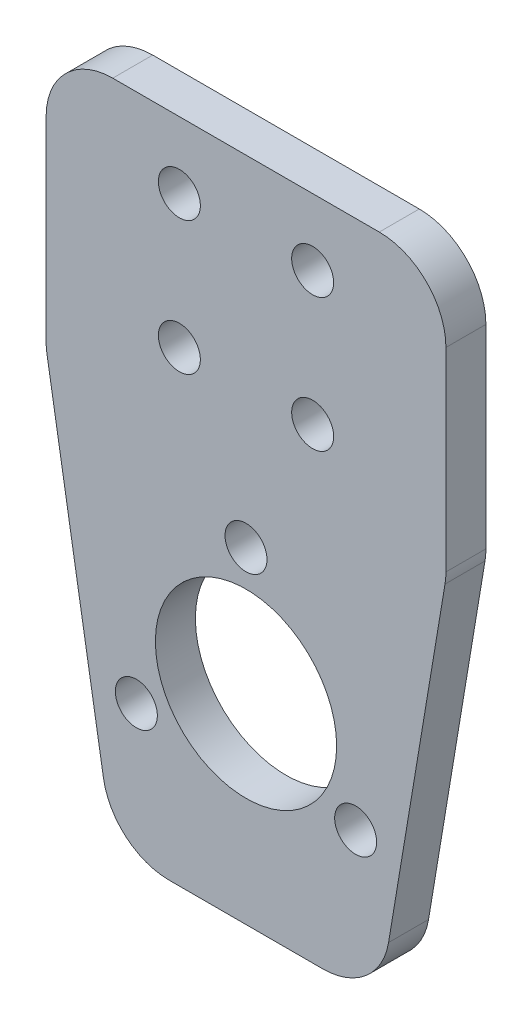
ISO-10303-21;
HEADER;
FILE_DESCRIPTION(('STEP AP214'),'2;1');
FILE_NAME('part.step','',(''),(''),'','','');
FILE_SCHEMA(('AUTOMOTIVE_DESIGN { 1 0 10303 214 1 1 1 1 }'));
ENDSEC;
DATA;
#1=APPLICATION_CONTEXT('core data for automotive mechanical design processes');
#2=APPLICATION_PROTOCOL_DEFINITION('international standard','automotive_design',2000,#1);
#3=PRODUCT_CONTEXT('',#1,'mechanical');
#4=PRODUCT('Part','Part','',(#3));
#5=PRODUCT_RELATED_PRODUCT_CATEGORY('part','',(#4));
#6=PRODUCT_DEFINITION_FORMATION('','',#4);
#7=PRODUCT_DEFINITION_CONTEXT('part definition',#1,'design');
#8=PRODUCT_DEFINITION('design','',#6,#7);
#9=PRODUCT_DEFINITION_SHAPE('','',#8);
#10=(LENGTH_UNIT() NAMED_UNIT(*) SI_UNIT(.MILLI.,.METRE.));
#11=(NAMED_UNIT(*) PLANE_ANGLE_UNIT() SI_UNIT($,.RADIAN.));
#12=(NAMED_UNIT(*) SI_UNIT($,.STERADIAN.) SOLID_ANGLE_UNIT());
#13=UNCERTAINTY_MEASURE_WITH_UNIT(LENGTH_MEASURE(1.E-05),#10,'distance_accuracy_value','');
#14=(GEOMETRIC_REPRESENTATION_CONTEXT(3) GLOBAL_UNCERTAINTY_ASSIGNED_CONTEXT((#13)) GLOBAL_UNIT_ASSIGNED_CONTEXT((#10,
#11,#12)) REPRESENTATION_CONTEXT('',''));
#15=CARTESIAN_POINT('',(0.,0.,0.));
#16=DIRECTION('',(0.,0.,1.));
#17=DIRECTION('',(1.,0.,0.));
#18=AXIS2_PLACEMENT_3D('',#15,#16,#17);
#19=CARTESIAN_POINT('',(30.,0.,3.));
#20=DIRECTION('',(0.,-1.,0.));
#21=DIRECTION('',(1.,0.,0.));
#22=AXIS2_PLACEMENT_3D('',#19,#20,#21);
#23=PLANE('',#22);
#24=DIRECTION('',(-1.,0.,0.));
#25=VECTOR('',#24,1.);
#26=CARTESIAN_POINT('',(30.,0.,3.));
#27=LINE('',#26,#25);
#28=CARTESIAN_POINT('',(25.,0.,3.));
#29=VERTEX_POINT('',#28);
#30=CARTESIAN_POINT('',(5.,0.,3.));
#31=VERTEX_POINT('',#30);
#32=EDGE_CURVE('E169',#29,#31,#27,.T.);
#33=ORIENTED_EDGE('',*,*,#32,.F.);
#34=DIRECTION('',(0.,0.,-1.));
#35=VECTOR('',#34,1.);
#36=CARTESIAN_POINT('',(25.,0.,3.));
#37=LINE('',#36,#35);
#38=CARTESIAN_POINT('',(25.,0.,0.));
#39=VERTEX_POINT('',#38);
#40=EDGE_CURVE('E11',#29,#39,#37,.T.);
#41=ORIENTED_EDGE('',*,*,#40,.T.);
#42=DIRECTION('',(-1.,0.,0.));
#43=VECTOR('',#42,1.);
#44=CARTESIAN_POINT('',(30.,0.,0.));
#45=LINE('',#44,#43);
#46=CARTESIAN_POINT('',(5.,0.,0.));
#47=VERTEX_POINT('',#46);
#48=EDGE_CURVE('E239',#39,#47,#45,.T.);
#49=ORIENTED_EDGE('',*,*,#48,.T.);
#50=DIRECTION('',(0.,0.,-1.));
#51=VECTOR('',#50,1.);
#52=CARTESIAN_POINT('',(5.,0.,3.));
#53=LINE('',#52,#51);
#54=EDGE_CURVE('E52',#47,#31,#53,.F.);
#55=ORIENTED_EDGE('',*,*,#54,.T.);
#56=EDGE_LOOP('',(#33,#41,#49,#55));
#57=FACE_BOUND('',#56,.T.);
#58=ADVANCED_FACE('F43',(#57),#23,.F.);
#59=CARTESIAN_POINT('',(0.,0.,3.));
#60=DIRECTION('',(1.,0.,0.));
#61=DIRECTION('',(0.,1.,0.));
#62=AXIS2_PLACEMENT_3D('',#59,#60,#61);
#63=PLANE('',#62);
#64=DIRECTION('',(0.,-1.,0.));
#65=VECTOR('',#64,1.);
#66=CARTESIAN_POINT('',(0.,0.,0.));
#67=LINE('',#66,#65);
#68=CARTESIAN_POINT('',(0.,-5.,0.));
#69=VERTEX_POINT('',#68);
#70=CARTESIAN_POINT('',(0.,-19.5861873485089,0.));
#71=VERTEX_POINT('',#70);
#72=EDGE_CURVE('E255',#69,#71,#67,.T.);
#73=ORIENTED_EDGE('',*,*,#72,.T.);
#74=DIRECTION('',(0.,0.,-1.));
#75=VECTOR('',#74,1.);
#76=CARTESIAN_POINT('',(0.,-19.5861873485089,3.));
#77=LINE('',#76,#75);
#78=CARTESIAN_POINT('',(0.,-19.5861873485089,3.));
#79=VERTEX_POINT('',#78);
#80=EDGE_CURVE('E223',#71,#79,#77,.F.);
#81=ORIENTED_EDGE('',*,*,#80,.T.);
#82=DIRECTION('',(0.,-1.,0.));
#83=VECTOR('',#82,1.);
#84=CARTESIAN_POINT('',(0.,0.,3.));
#85=LINE('',#84,#83);
#86=CARTESIAN_POINT('',(0.,-5.,3.));
#87=VERTEX_POINT('',#86);
#88=EDGE_CURVE('E248',#87,#79,#85,.T.);
#89=ORIENTED_EDGE('',*,*,#88,.F.);
#90=DIRECTION('',(0.,0.,-1.));
#91=VECTOR('',#90,1.);
#92=CARTESIAN_POINT('',(0.,-5.,3.));
#93=LINE('',#92,#91);
#94=EDGE_CURVE('E219',#87,#69,#93,.T.);
#95=ORIENTED_EDGE('',*,*,#94,.T.);
#96=EDGE_LOOP('',(#73,#81,#89,#95));
#97=FACE_BOUND('',#96,.T.);
#98=ADVANCED_FACE('F254',(#97),#63,.F.);
#99=CARTESIAN_POINT('',(0.,-20.,3.));
#100=DIRECTION('',(0.986393923832144,0.164398987305357,0.));
#101=DIRECTION('',(-0.164398987305357,0.986393923832144,0.));
#102=AXIS2_PLACEMENT_3D('',#99,#100,#101);
#103=PLANE('',#102);
#104=DIRECTION('',(0.164398987305357,-0.986393923832144,0.));
#105=VECTOR('',#104,1.);
#106=CARTESIAN_POINT('',(0.,-20.,0.));
#107=LINE('',#106,#105);
#108=CARTESIAN_POINT('',(0.0680303808392843,-20.4081822850357,0.));
#109=VERTEX_POINT('',#108);
#110=CARTESIAN_POINT('',(4.30366582275447,-45.8219949365268,0.));
#111=VERTEX_POINT('',#110);
#112=EDGE_CURVE('E171',#109,#111,#107,.T.);
#113=ORIENTED_EDGE('',*,*,#112,.T.);
#114=DIRECTION('',(0.,0.,-1.));
#115=VECTOR('',#114,1.);
#116=CARTESIAN_POINT('',(4.30366582275447,-45.8219949365268,3.));
#117=LINE('',#116,#115);
#118=CARTESIAN_POINT('',(4.30366582275447,-45.8219949365268,3.));
#119=VERTEX_POINT('',#118);
#120=EDGE_CURVE('E216',#111,#119,#117,.F.);
#121=ORIENTED_EDGE('',*,*,#120,.T.);
#122=DIRECTION('',(0.164398987305357,-0.986393923832144,0.));
#123=VECTOR('',#122,1.);
#124=CARTESIAN_POINT('',(0.,-20.,3.));
#125=LINE('',#124,#123);
#126=CARTESIAN_POINT('',(0.0680303808392843,-20.4081822850357,3.));
#127=VERTEX_POINT('',#126);
#128=EDGE_CURVE('E273',#127,#119,#125,.T.);
#129=ORIENTED_EDGE('',*,*,#128,.F.);
#130=DIRECTION('',(0.,0.,-1.));
#131=VECTOR('',#130,1.);
#132=CARTESIAN_POINT('',(0.0680303808392844,-20.4081822850357,3.));
#133=LINE('',#132,#131);
#134=EDGE_CURVE('E212',#127,#109,#133,.T.);
#135=ORIENTED_EDGE('',*,*,#134,.T.);
#136=EDGE_LOOP('',(#113,#121,#129,#135));
#137=FACE_BOUND('',#136,.T.);
#138=ADVANCED_FACE('F374',(#137),#103,.F.);
#139=CARTESIAN_POINT('',(25.,-50.,3.));
#140=DIRECTION('',(0.,1.,0.));
#141=DIRECTION('',(0.,0.,1.));
#142=AXIS2_PLACEMENT_3D('',#139,#140,#141);
#143=PLANE('',#142);
#144=DIRECTION('',(1.,0.,0.));
#145=VECTOR('',#144,1.);
#146=CARTESIAN_POINT('',(25.,-50.,0.));
#147=LINE('',#146,#145);
#148=CARTESIAN_POINT('',(9.23563544191519,-50.,0.));
#149=VERTEX_POINT('',#148);
#150=CARTESIAN_POINT('',(20.7643645580848,-50.,0.));
#151=VERTEX_POINT('',#150);
#152=EDGE_CURVE('E165',#149,#151,#147,.T.);
#153=ORIENTED_EDGE('',*,*,#152,.T.);
#154=DIRECTION('',(0.,0.,-1.));
#155=VECTOR('',#154,1.);
#156=CARTESIAN_POINT('',(20.7643645580848,-50.,3.));
#157=LINE('',#156,#155);
#158=CARTESIAN_POINT('',(20.7643645580848,-50.,3.));
#159=VERTEX_POINT('',#158);
#160=EDGE_CURVE('E140',#151,#159,#157,.F.);
#161=ORIENTED_EDGE('',*,*,#160,.T.);
#162=DIRECTION('',(1.,0.,0.));
#163=VECTOR('',#162,1.);
#164=CARTESIAN_POINT('',(25.,-50.,3.));
#165=LINE('',#164,#163);
#166=CARTESIAN_POINT('',(9.23563544191519,-50.,3.));
#167=VERTEX_POINT('',#166);
#168=EDGE_CURVE('E270',#167,#159,#165,.T.);
#169=ORIENTED_EDGE('',*,*,#168,.F.);
#170=DIRECTION('',(0.,0.,-1.));
#171=VECTOR('',#170,1.);
#172=CARTESIAN_POINT('',(9.23563544191519,-50.,3.));
#173=LINE('',#172,#171);
#174=EDGE_CURVE('E146',#167,#149,#173,.T.);
#175=ORIENTED_EDGE('',*,*,#174,.T.);
#176=EDGE_LOOP('',(#153,#161,#169,#175));
#177=FACE_BOUND('',#176,.T.);
#178=ADVANCED_FACE('F403',(#177),#143,.F.);
#179=CARTESIAN_POINT('',(30.,-20.,3.));
#180=DIRECTION('',(-0.986393923832144,0.164398987305357,0.));
#181=DIRECTION('',(-0.164398987305357,-0.986393923832144,0.));
#182=AXIS2_PLACEMENT_3D('',#179,#180,#181);
#183=PLANE('',#182);
#184=DIRECTION('',(0.164398987305357,0.986393923832144,0.));
#185=VECTOR('',#184,1.);
#186=CARTESIAN_POINT('',(30.,-20.,3.));
#187=LINE('',#186,#185);
#188=CARTESIAN_POINT('',(25.6963341772455,-45.8219949365268,3.));
#189=VERTEX_POINT('',#188);
#190=CARTESIAN_POINT('',(29.9319696191607,-20.4081822850357,3.));
#191=VERTEX_POINT('',#190);
#192=EDGE_CURVE('E155',#189,#191,#187,.T.);
#193=ORIENTED_EDGE('',*,*,#192,.F.);
#194=DIRECTION('',(0.,0.,-1.));
#195=VECTOR('',#194,1.);
#196=CARTESIAN_POINT('',(25.6963341772455,-45.8219949365268,3.));
#197=LINE('',#196,#195);
#198=CARTESIAN_POINT('',(25.6963341772455,-45.8219949365268,0.));
#199=VERTEX_POINT('',#198);
#200=EDGE_CURVE('E139',#189,#199,#197,.T.);
#201=ORIENTED_EDGE('',*,*,#200,.T.);
#202=DIRECTION('',(0.164398987305357,0.986393923832144,0.));
#203=VECTOR('',#202,1.);
#204=CARTESIAN_POINT('',(30.,-20.,0.));
#205=LINE('',#204,#203);
#206=CARTESIAN_POINT('',(29.9319696191607,-20.4081822850357,0.));
#207=VERTEX_POINT('',#206);
#208=EDGE_CURVE('E153',#199,#207,#205,.T.);
#209=ORIENTED_EDGE('',*,*,#208,.T.);
#210=DIRECTION('',(0.,0.,-1.));
#211=VECTOR('',#210,1.);
#212=CARTESIAN_POINT('',(29.9319696191607,-20.4081822850357,3.));
#213=LINE('',#212,#211);
#214=EDGE_CURVE('E158',#207,#191,#213,.F.);
#215=ORIENTED_EDGE('',*,*,#214,.T.);
#216=EDGE_LOOP('',(#193,#201,#209,#215));
#217=FACE_BOUND('',#216,.T.);
#218=ADVANCED_FACE('F152',(#217),#183,.F.);
#219=CARTESIAN_POINT('',(30.,-20.,3.));
#220=DIRECTION('',(-1.,0.,0.));
#221=DIRECTION('',(0.,-1.,0.));
#222=AXIS2_PLACEMENT_3D('',#219,#220,#221);
#223=PLANE('',#222);
#224=DIRECTION('',(0.,1.,0.));
#225=VECTOR('',#224,1.);
#226=CARTESIAN_POINT('',(30.,-20.,3.));
#227=LINE('',#226,#225);
#228=CARTESIAN_POINT('',(30.,-19.5861873485089,3.));
#229=VERTEX_POINT('',#228);
#230=CARTESIAN_POINT('',(30.,-5.,3.));
#231=VERTEX_POINT('',#230);
#232=EDGE_CURVE('E176',#229,#231,#227,.T.);
#233=ORIENTED_EDGE('',*,*,#232,.F.);
#234=DIRECTION('',(0.,0.,-1.));
#235=VECTOR('',#234,1.);
#236=CARTESIAN_POINT('',(30.,-19.5861873485089,3.));
#237=LINE('',#236,#235);
#238=CARTESIAN_POINT('',(30.,-19.5861873485089,0.));
#239=VERTEX_POINT('',#238);
#240=EDGE_CURVE('E228',#229,#239,#237,.T.);
#241=ORIENTED_EDGE('',*,*,#240,.T.);
#242=DIRECTION('',(0.,1.,0.));
#243=VECTOR('',#242,1.);
#244=CARTESIAN_POINT('',(30.,-20.,0.));
#245=LINE('',#244,#243);
#246=CARTESIAN_POINT('',(30.,-5.,0.));
#247=VERTEX_POINT('',#246);
#248=EDGE_CURVE('E164',#239,#247,#245,.T.);
#249=ORIENTED_EDGE('',*,*,#248,.T.);
#250=DIRECTION('',(0.,0.,-1.));
#251=VECTOR('',#250,1.);
#252=CARTESIAN_POINT('',(30.,-5.,3.));
#253=LINE('',#252,#251);
#254=EDGE_CURVE('E59',#247,#231,#253,.F.);
#255=ORIENTED_EDGE('',*,*,#254,.T.);
#256=EDGE_LOOP('',(#233,#241,#249,#255));
#257=FACE_BOUND('',#256,.T.);
#258=ADVANCED_FACE('F347',(#257),#223,.F.);
#259=CARTESIAN_POINT('',(0.,0.,3.));
#260=DIRECTION('',(0.,0.,1.));
#261=DIRECTION('',(1.,0.,0.));
#262=AXIS2_PLACEMENT_3D('',#259,#260,#261);
#263=PLANE('',#262);
#264=CARTESIAN_POINT('',(23.2272413359522,-39.75,3.));
#265=DIRECTION('',(0.,0.,1.));
#266=DIRECTION('',(1.,0.,0.));
#267=AXIS2_PLACEMENT_3D('',#264,#265,#266);
#268=CIRCLE('',#267,1.575);
#269=CARTESIAN_POINT('',(24.8022413359522,-39.75,3.));
#270=VERTEX_POINT('',#269);
#271=EDGE_CURVE('E292',#270,#270,#268,.T.);
#272=ORIENTED_EDGE('',*,*,#271,.F.);
#273=EDGE_LOOP('',(#272));
#274=FACE_BOUND('',#273,.T.);
#275=CARTESIAN_POINT('',(15.,-35.,3.));
#276=DIRECTION('',(0.,0.,1.));
#277=DIRECTION('',(1.,0.,0.));
#278=AXIS2_PLACEMENT_3D('',#275,#276,#277);
#279=CIRCLE('',#278,6.8);
#280=CARTESIAN_POINT('',(21.8,-35.,3.));
#281=VERTEX_POINT('',#280);
#282=EDGE_CURVE('E291',#281,#281,#279,.T.);
#283=ORIENTED_EDGE('',*,*,#282,.F.);
#284=EDGE_LOOP('',(#283));
#285=FACE_BOUND('',#284,.T.);
#286=CARTESIAN_POINT('',(6.77275866404783,-39.75,3.));
#287=DIRECTION('',(0.,0.,1.));
#288=DIRECTION('',(1.,0.,0.));
#289=AXIS2_PLACEMENT_3D('',#286,#287,#288);
#290=CIRCLE('',#289,1.575);
#291=CARTESIAN_POINT('',(8.34775866404784,-39.75,3.));
#292=VERTEX_POINT('',#291);
#293=EDGE_CURVE('E301',#292,#292,#290,.T.);
#294=ORIENTED_EDGE('',*,*,#293,.F.);
#295=EDGE_LOOP('',(#294));
#296=FACE_BOUND('',#295,.T.);
#297=CARTESIAN_POINT('',(10.,-15.,3.));
#298=DIRECTION('',(0.,0.,1.));
#299=DIRECTION('',(1.,0.,0.));
#300=AXIS2_PLACEMENT_3D('',#297,#298,#299);
#301=CIRCLE('',#300,1.575);
#302=CARTESIAN_POINT('',(11.575,-15.,3.));
#303=VERTEX_POINT('',#302);
#304=EDGE_CURVE('E283',#303,#303,#301,.T.);
#305=ORIENTED_EDGE('',*,*,#304,.F.);
#306=EDGE_LOOP('',(#305));
#307=FACE_BOUND('',#306,.T.);
#308=CARTESIAN_POINT('',(20.,-15.,3.));
#309=DIRECTION('',(0.,0.,1.));
#310=DIRECTION('',(-1.,0.,0.));
#311=AXIS2_PLACEMENT_3D('',#308,#309,#310);
#312=CIRCLE('',#311,1.575);
#313=CARTESIAN_POINT('',(18.425,-15.,3.));
#314=VERTEX_POINT('',#313);
#315=EDGE_CURVE('E316',#314,#314,#312,.T.);
#316=ORIENTED_EDGE('',*,*,#315,.F.);
#317=EDGE_LOOP('',(#316));
#318=FACE_BOUND('',#317,.T.);
#319=CARTESIAN_POINT('',(20.,-4.99999999999999,3.));
#320=DIRECTION('',(0.,0.,1.));
#321=DIRECTION('',(1.,0.,0.));
#322=AXIS2_PLACEMENT_3D('',#319,#320,#321);
#323=CIRCLE('',#322,1.575);
#324=CARTESIAN_POINT('',(21.575,-4.99999999999999,3.));
#325=VERTEX_POINT('',#324);
#326=EDGE_CURVE('E317',#325,#325,#323,.T.);
#327=ORIENTED_EDGE('',*,*,#326,.F.);
#328=EDGE_LOOP('',(#327));
#329=FACE_BOUND('',#328,.T.);
#330=CARTESIAN_POINT('',(15.,-25.5,3.));
#331=DIRECTION('',(0.,0.,1.));
#332=DIRECTION('',(1.,0.,0.));
#333=AXIS2_PLACEMENT_3D('',#330,#331,#332);
#334=CIRCLE('',#333,1.575);
#335=CARTESIAN_POINT('',(16.575,-25.5,3.));
#336=VERTEX_POINT('',#335);
#337=EDGE_CURVE('E331',#336,#336,#334,.T.);
#338=ORIENTED_EDGE('',*,*,#337,.F.);
#339=EDGE_LOOP('',(#338));
#340=FACE_BOUND('',#339,.T.);
#341=CARTESIAN_POINT('',(10.,-4.99999999999999,3.));
#342=DIRECTION('',(0.,0.,1.));
#343=DIRECTION('',(-1.,0.,0.));
#344=AXIS2_PLACEMENT_3D('',#341,#342,#343);
#345=CIRCLE('',#344,1.575);
#346=CARTESIAN_POINT('',(8.425,-4.99999999999999,3.));
#347=VERTEX_POINT('',#346);
#348=EDGE_CURVE('E279',#347,#347,#345,.T.);
#349=ORIENTED_EDGE('',*,*,#348,.F.);
#350=EDGE_LOOP('',(#349));
#351=FACE_BOUND('',#350,.T.);
#352=ORIENTED_EDGE('',*,*,#168,.T.);
#353=CARTESIAN_POINT('',(20.7643645580848,-45.,3.));
#354=DIRECTION('',(0.,0.,1.));
#355=DIRECTION('',(1.,0.,0.));
#356=AXIS2_PLACEMENT_3D('',#353,#354,#355);
#357=CIRCLE('',#356,5.);
#358=EDGE_CURVE('E209',#159,#189,#357,.T.);
#359=ORIENTED_EDGE('',*,*,#358,.T.);
#360=ORIENTED_EDGE('',*,*,#192,.T.);
#361=CARTESIAN_POINT('',(25.,-19.5861873485089,3.));
#362=DIRECTION('',(0.,0.,1.));
#363=DIRECTION('',(1.,0.,0.));
#364=AXIS2_PLACEMENT_3D('',#361,#362,#363);
#365=CIRCLE('',#364,5.);
#366=EDGE_CURVE('E66',#191,#229,#365,.T.);
#367=ORIENTED_EDGE('',*,*,#366,.T.);
#368=ORIENTED_EDGE('',*,*,#232,.T.);
#369=CARTESIAN_POINT('',(25.,-5.,3.));
#370=DIRECTION('',(0.,0.,1.));
#371=DIRECTION('',(1.,0.,0.));
#372=AXIS2_PLACEMENT_3D('',#369,#370,#371);
#373=CIRCLE('',#372,5.);
#374=EDGE_CURVE('E198',#231,#29,#373,.T.);
#375=ORIENTED_EDGE('',*,*,#374,.T.);
#376=ORIENTED_EDGE('',*,*,#32,.T.);
#377=CARTESIAN_POINT('',(5.,-5.,3.));
#378=DIRECTION('',(0.,0.,1.));
#379=DIRECTION('',(1.,0.,0.));
#380=AXIS2_PLACEMENT_3D('',#377,#378,#379);
#381=CIRCLE('',#380,5.);
#382=EDGE_CURVE('E195',#31,#87,#381,.T.);
#383=ORIENTED_EDGE('',*,*,#382,.T.);
#384=ORIENTED_EDGE('',*,*,#88,.T.);
#385=CARTESIAN_POINT('',(5.,-19.5861873485089,3.));
#386=DIRECTION('',(0.,0.,1.));
#387=DIRECTION('',(1.,0.,0.));
#388=AXIS2_PLACEMENT_3D('',#385,#386,#387);
#389=CIRCLE('',#388,5.);
#390=EDGE_CURVE('E203',#79,#127,#389,.T.);
#391=ORIENTED_EDGE('',*,*,#390,.T.);
#392=ORIENTED_EDGE('',*,*,#128,.T.);
#393=CARTESIAN_POINT('',(9.23563544191519,-45.,3.));
#394=DIRECTION('',(0.,0.,1.));
#395=DIRECTION('',(1.,0.,0.));
#396=AXIS2_PLACEMENT_3D('',#393,#394,#395);
#397=CIRCLE('',#396,5.);
#398=EDGE_CURVE('E206',#119,#167,#397,.T.);
#399=ORIENTED_EDGE('',*,*,#398,.T.);
#400=EDGE_LOOP('',(#352,#359,#360,#367,#368,#375,#376,#383,#384,#391,#392,#399));
#401=FACE_BOUND('',#400,.T.);
#402=ADVANCED_FACE('F243',(#274,#285,#296,#307,#318,#329,#340,#351,#401),#263,.T.);
#403=CARTESIAN_POINT('',(0.,0.,0.));
#404=DIRECTION('',(0.,0.,1.));
#405=DIRECTION('',(1.,0.,0.));
#406=AXIS2_PLACEMENT_3D('',#403,#404,#405);
#407=PLANE('',#406);
#408=CARTESIAN_POINT('',(23.2272413359522,-39.75,0.));
#409=DIRECTION('',(0.,0.,1.));
#410=DIRECTION('',(1.,0.,0.));
#411=AXIS2_PLACEMENT_3D('',#408,#409,#410);
#412=CIRCLE('',#411,1.575);
#413=CARTESIAN_POINT('',(24.8022413359522,-39.75,0.));
#414=VERTEX_POINT('',#413);
#415=EDGE_CURVE('E297',#414,#414,#412,.T.);
#416=ORIENTED_EDGE('',*,*,#415,.T.);
#417=EDGE_LOOP('',(#416));
#418=FACE_BOUND('',#417,.T.);
#419=CARTESIAN_POINT('',(15.,-35.,0.));
#420=DIRECTION('',(0.,0.,1.));
#421=DIRECTION('',(1.,0.,0.));
#422=AXIS2_PLACEMENT_3D('',#419,#420,#421);
#423=CIRCLE('',#422,6.8);
#424=CARTESIAN_POINT('',(21.8,-35.,0.));
#425=VERTEX_POINT('',#424);
#426=EDGE_CURVE('E287',#425,#425,#423,.T.);
#427=ORIENTED_EDGE('',*,*,#426,.T.);
#428=EDGE_LOOP('',(#427));
#429=FACE_BOUND('',#428,.T.);
#430=CARTESIAN_POINT('',(6.77275866404783,-39.75,0.));
#431=DIRECTION('',(0.,0.,1.));
#432=DIRECTION('',(1.,0.,0.));
#433=AXIS2_PLACEMENT_3D('',#430,#431,#432);
#434=CIRCLE('',#433,1.575);
#435=CARTESIAN_POINT('',(8.34775866404784,-39.75,0.));
#436=VERTEX_POINT('',#435);
#437=EDGE_CURVE('E305',#436,#436,#434,.T.);
#438=ORIENTED_EDGE('',*,*,#437,.T.);
#439=EDGE_LOOP('',(#438));
#440=FACE_BOUND('',#439,.T.);
#441=CARTESIAN_POINT('',(10.,-15.,0.));
#442=DIRECTION('',(0.,0.,1.));
#443=DIRECTION('',(1.,0.,0.));
#444=AXIS2_PLACEMENT_3D('',#441,#442,#443);
#445=CIRCLE('',#444,1.575);
#446=CARTESIAN_POINT('',(11.575,-15.,0.));
#447=VERTEX_POINT('',#446);
#448=EDGE_CURVE('E321',#447,#447,#445,.T.);
#449=ORIENTED_EDGE('',*,*,#448,.T.);
#450=EDGE_LOOP('',(#449));
#451=FACE_BOUND('',#450,.T.);
#452=CARTESIAN_POINT('',(20.,-15.,0.));
#453=DIRECTION('',(0.,0.,1.));
#454=DIRECTION('',(-1.,0.,0.));
#455=AXIS2_PLACEMENT_3D('',#452,#453,#454);
#456=CIRCLE('',#455,1.575);
#457=CARTESIAN_POINT('',(18.425,-15.,0.));
#458=VERTEX_POINT('',#457);
#459=EDGE_CURVE('E312',#458,#458,#456,.T.);
#460=ORIENTED_EDGE('',*,*,#459,.T.);
#461=EDGE_LOOP('',(#460));
#462=FACE_BOUND('',#461,.T.);
#463=CARTESIAN_POINT('',(20.,-4.99999999999999,0.));
#464=DIRECTION('',(0.,0.,1.));
#465=DIRECTION('',(1.,0.,0.));
#466=AXIS2_PLACEMENT_3D('',#463,#464,#465);
#467=CIRCLE('',#466,1.575);
#468=CARTESIAN_POINT('',(21.575,-4.99999999999999,0.));
#469=VERTEX_POINT('',#468);
#470=EDGE_CURVE('E335',#469,#469,#467,.T.);
#471=ORIENTED_EDGE('',*,*,#470,.T.);
#472=EDGE_LOOP('',(#471));
#473=FACE_BOUND('',#472,.T.);
#474=CARTESIAN_POINT('',(15.,-25.5,0.));
#475=DIRECTION('',(0.,0.,1.));
#476=DIRECTION('',(1.,0.,0.));
#477=AXIS2_PLACEMENT_3D('',#474,#475,#476);
#478=CIRCLE('',#477,1.575);
#479=CARTESIAN_POINT('',(16.575,-25.5,0.));
#480=VERTEX_POINT('',#479);
#481=EDGE_CURVE('E296',#480,#480,#478,.T.);
#482=ORIENTED_EDGE('',*,*,#481,.T.);
#483=EDGE_LOOP('',(#482));
#484=FACE_BOUND('',#483,.T.);
#485=CARTESIAN_POINT('',(10.,-4.99999999999999,0.));
#486=DIRECTION('',(0.,0.,1.));
#487=DIRECTION('',(-1.,0.,0.));
#488=AXIS2_PLACEMENT_3D('',#485,#486,#487);
#489=CIRCLE('',#488,1.575);
#490=CARTESIAN_POINT('',(8.425,-4.99999999999999,0.));
#491=VERTEX_POINT('',#490);
#492=EDGE_CURVE('E263',#491,#491,#489,.T.);
#493=ORIENTED_EDGE('',*,*,#492,.T.);
#494=EDGE_LOOP('',(#493));
#495=FACE_BOUND('',#494,.T.);
#496=ORIENTED_EDGE('',*,*,#208,.F.);
#497=CARTESIAN_POINT('',(20.7643645580848,-45.,0.));
#498=DIRECTION('',(0.,0.,1.));
#499=DIRECTION('',(1.,0.,0.));
#500=AXIS2_PLACEMENT_3D('',#497,#498,#499);
#501=CIRCLE('',#500,5.);
#502=EDGE_CURVE('E135',#199,#151,#501,.F.);
#503=ORIENTED_EDGE('',*,*,#502,.T.);
#504=ORIENTED_EDGE('',*,*,#152,.F.);
#505=CARTESIAN_POINT('',(9.23563544191519,-45.,0.));
#506=DIRECTION('',(0.,0.,1.));
#507=DIRECTION('',(1.,0.,0.));
#508=AXIS2_PLACEMENT_3D('',#505,#506,#507);
#509=CIRCLE('',#508,5.);
#510=EDGE_CURVE('E147',#149,#111,#509,.F.);
#511=ORIENTED_EDGE('',*,*,#510,.T.);
#512=ORIENTED_EDGE('',*,*,#112,.F.);
#513=CARTESIAN_POINT('',(5.,-19.5861873485089,0.));
#514=DIRECTION('',(0.,0.,1.));
#515=DIRECTION('',(1.,0.,0.));
#516=AXIS2_PLACEMENT_3D('',#513,#514,#515);
#517=CIRCLE('',#516,5.);
#518=EDGE_CURVE('E185',#109,#71,#517,.F.);
#519=ORIENTED_EDGE('',*,*,#518,.T.);
#520=ORIENTED_EDGE('',*,*,#72,.F.);
#521=CARTESIAN_POINT('',(5.,-5.,0.));
#522=DIRECTION('',(0.,0.,1.));
#523=DIRECTION('',(1.,0.,0.));
#524=AXIS2_PLACEMENT_3D('',#521,#522,#523);
#525=CIRCLE('',#524,5.);
#526=EDGE_CURVE('E157',#69,#47,#525,.F.);
#527=ORIENTED_EDGE('',*,*,#526,.T.);
#528=ORIENTED_EDGE('',*,*,#48,.F.);
#529=CARTESIAN_POINT('',(25.,-5.,0.));
#530=DIRECTION('',(0.,0.,1.));
#531=DIRECTION('',(1.,0.,0.));
#532=AXIS2_PLACEMENT_3D('',#529,#530,#531);
#533=CIRCLE('',#532,5.);
#534=EDGE_CURVE('E180',#39,#247,#533,.F.);
#535=ORIENTED_EDGE('',*,*,#534,.T.);
#536=ORIENTED_EDGE('',*,*,#248,.F.);
#537=CARTESIAN_POINT('',(25.,-19.5861873485089,0.));
#538=DIRECTION('',(0.,0.,1.));
#539=DIRECTION('',(1.,0.,0.));
#540=AXIS2_PLACEMENT_3D('',#537,#538,#539);
#541=CIRCLE('',#540,5.);
#542=EDGE_CURVE('E162',#239,#207,#541,.F.);
#543=ORIENTED_EDGE('',*,*,#542,.T.);
#544=EDGE_LOOP('',(#496,#503,#504,#511,#512,#519,#520,#527,#528,#535,#536,#543));
#545=FACE_BOUND('',#544,.T.);
#546=ADVANCED_FACE('F160',(#418,#429,#440,#451,#462,#473,#484,#495,#545),#407,.F.);
#547=CARTESIAN_POINT('',(10.,-4.99999999999999,0.));
#548=DIRECTION('',(0.,0.,1.));
#549=DIRECTION('',(1.,0.,0.));
#550=AXIS2_PLACEMENT_3D('',#547,#548,#549);
#551=CYLINDRICAL_SURFACE('',#550,1.575);
#552=ORIENTED_EDGE('',*,*,#492,.F.);
#553=EDGE_LOOP('',(#552));
#554=FACE_BOUND('',#553,.T.);
#555=ORIENTED_EDGE('',*,*,#348,.T.);
#556=EDGE_LOOP('',(#555));
#557=FACE_BOUND('',#556,.T.);
#558=ADVANCED_FACE('F354',(#554,#557),#551,.F.);
#559=CARTESIAN_POINT('',(15.,-25.5,0.));
#560=DIRECTION('',(0.,0.,1.));
#561=DIRECTION('',(1.,0.,0.));
#562=AXIS2_PLACEMENT_3D('',#559,#560,#561);
#563=CYLINDRICAL_SURFACE('',#562,1.575);
#564=ORIENTED_EDGE('',*,*,#481,.F.);
#565=EDGE_LOOP('',(#564));
#566=FACE_BOUND('',#565,.T.);
#567=ORIENTED_EDGE('',*,*,#337,.T.);
#568=EDGE_LOOP('',(#567));
#569=FACE_BOUND('',#568,.T.);
#570=ADVANCED_FACE('F356',(#566,#569),#563,.F.);
#571=CARTESIAN_POINT('',(20.,-4.99999999999999,0.));
#572=DIRECTION('',(0.,0.,1.));
#573=DIRECTION('',(1.,0.,0.));
#574=AXIS2_PLACEMENT_3D('',#571,#572,#573);
#575=CYLINDRICAL_SURFACE('',#574,1.575);
#576=ORIENTED_EDGE('',*,*,#470,.F.);
#577=EDGE_LOOP('',(#576));
#578=FACE_BOUND('',#577,.T.);
#579=ORIENTED_EDGE('',*,*,#326,.T.);
#580=EDGE_LOOP('',(#579));
#581=FACE_BOUND('',#580,.T.);
#582=ADVANCED_FACE('F343',(#578,#581),#575,.F.);
#583=CARTESIAN_POINT('',(20.,-15.,0.));
#584=DIRECTION('',(0.,0.,1.));
#585=DIRECTION('',(1.,0.,0.));
#586=AXIS2_PLACEMENT_3D('',#583,#584,#585);
#587=CYLINDRICAL_SURFACE('',#586,1.575);
#588=ORIENTED_EDGE('',*,*,#459,.F.);
#589=EDGE_LOOP('',(#588));
#590=FACE_BOUND('',#589,.T.);
#591=ORIENTED_EDGE('',*,*,#315,.T.);
#592=EDGE_LOOP('',(#591));
#593=FACE_BOUND('',#592,.T.);
#594=ADVANCED_FACE('F516',(#590,#593),#587,.F.);
#595=CARTESIAN_POINT('',(10.,-15.,0.));
#596=DIRECTION('',(0.,0.,1.));
#597=DIRECTION('',(1.,0.,0.));
#598=AXIS2_PLACEMENT_3D('',#595,#596,#597);
#599=CYLINDRICAL_SURFACE('',#598,1.575);
#600=ORIENTED_EDGE('',*,*,#448,.F.);
#601=EDGE_LOOP('',(#600));
#602=FACE_BOUND('',#601,.T.);
#603=ORIENTED_EDGE('',*,*,#304,.T.);
#604=EDGE_LOOP('',(#603));
#605=FACE_BOUND('',#604,.T.);
#606=ADVANCED_FACE('F506',(#602,#605),#599,.F.);
#607=CARTESIAN_POINT('',(6.77275866404783,-39.75,0.));
#608=DIRECTION('',(0.,0.,1.));
#609=DIRECTION('',(1.,0.,0.));
#610=AXIS2_PLACEMENT_3D('',#607,#608,#609);
#611=CYLINDRICAL_SURFACE('',#610,1.575);
#612=ORIENTED_EDGE('',*,*,#437,.F.);
#613=EDGE_LOOP('',(#612));
#614=FACE_BOUND('',#613,.T.);
#615=ORIENTED_EDGE('',*,*,#293,.T.);
#616=EDGE_LOOP('',(#615));
#617=FACE_BOUND('',#616,.T.);
#618=ADVANCED_FACE('F497',(#614,#617),#611,.F.);
#619=CARTESIAN_POINT('',(15.,-35.,0.));
#620=DIRECTION('',(0.,0.,1.));
#621=DIRECTION('',(1.,0.,0.));
#622=AXIS2_PLACEMENT_3D('',#619,#620,#621);
#623=CYLINDRICAL_SURFACE('',#622,6.8);
#624=ORIENTED_EDGE('',*,*,#426,.F.);
#625=EDGE_LOOP('',(#624));
#626=FACE_BOUND('',#625,.T.);
#627=ORIENTED_EDGE('',*,*,#282,.T.);
#628=EDGE_LOOP('',(#627));
#629=FACE_BOUND('',#628,.T.);
#630=ADVANCED_FACE('F487',(#626,#629),#623,.F.);
#631=CARTESIAN_POINT('',(23.2272413359522,-39.75,0.));
#632=DIRECTION('',(0.,0.,1.));
#633=DIRECTION('',(1.,0.,0.));
#634=AXIS2_PLACEMENT_3D('',#631,#632,#633);
#635=CYLINDRICAL_SURFACE('',#634,1.575);
#636=ORIENTED_EDGE('',*,*,#415,.F.);
#637=EDGE_LOOP('',(#636));
#638=FACE_BOUND('',#637,.T.);
#639=ORIENTED_EDGE('',*,*,#271,.T.);
#640=EDGE_LOOP('',(#639));
#641=FACE_BOUND('',#640,.T.);
#642=ADVANCED_FACE('F381',(#638,#641),#635,.F.);
#643=CARTESIAN_POINT('',(20.7643645580848,-45.,3.));
#644=DIRECTION('',(0.,0.,-1.));
#645=DIRECTION('',(-1.,0.,0.));
#646=AXIS2_PLACEMENT_3D('',#643,#644,#645);
#647=CYLINDRICAL_SURFACE('',#646,5.);
#648=ORIENTED_EDGE('',*,*,#358,.F.);
#649=ORIENTED_EDGE('',*,*,#160,.F.);
#650=ORIENTED_EDGE('',*,*,#502,.F.);
#651=ORIENTED_EDGE('',*,*,#200,.F.);
#652=EDGE_LOOP('',(#648,#649,#650,#651));
#653=FACE_BOUND('',#652,.T.);
#654=ADVANCED_FACE('F138',(#653),#647,.T.);
#655=CARTESIAN_POINT('',(9.23563544191519,-45.,3.));
#656=DIRECTION('',(0.,0.,-1.));
#657=DIRECTION('',(-1.,0.,0.));
#658=AXIS2_PLACEMENT_3D('',#655,#656,#657);
#659=CYLINDRICAL_SURFACE('',#658,5.);
#660=ORIENTED_EDGE('',*,*,#398,.F.);
#661=ORIENTED_EDGE('',*,*,#120,.F.);
#662=ORIENTED_EDGE('',*,*,#510,.F.);
#663=ORIENTED_EDGE('',*,*,#174,.F.);
#664=EDGE_LOOP('',(#660,#661,#662,#663));
#665=FACE_BOUND('',#664,.T.);
#666=ADVANCED_FACE('F380',(#665),#659,.T.);
#667=CARTESIAN_POINT('',(5.,-19.5861873485089,3.));
#668=DIRECTION('',(0.,0.,-1.));
#669=DIRECTION('',(-1.,0.,0.));
#670=AXIS2_PLACEMENT_3D('',#667,#668,#669);
#671=CYLINDRICAL_SURFACE('',#670,5.);
#672=ORIENTED_EDGE('',*,*,#390,.F.);
#673=ORIENTED_EDGE('',*,*,#80,.F.);
#674=ORIENTED_EDGE('',*,*,#518,.F.);
#675=ORIENTED_EDGE('',*,*,#134,.F.);
#676=EDGE_LOOP('',(#672,#673,#674,#675));
#677=FACE_BOUND('',#676,.T.);
#678=ADVANCED_FACE('F384',(#677),#671,.T.);
#679=CARTESIAN_POINT('',(25.,-19.5861873485089,3.));
#680=DIRECTION('',(0.,0.,-1.));
#681=DIRECTION('',(-1.,0.,0.));
#682=AXIS2_PLACEMENT_3D('',#679,#680,#681);
#683=CYLINDRICAL_SURFACE('',#682,5.);
#684=ORIENTED_EDGE('',*,*,#366,.F.);
#685=ORIENTED_EDGE('',*,*,#214,.F.);
#686=ORIENTED_EDGE('',*,*,#542,.F.);
#687=ORIENTED_EDGE('',*,*,#240,.F.);
#688=EDGE_LOOP('',(#684,#685,#686,#687));
#689=FACE_BOUND('',#688,.T.);
#690=ADVANCED_FACE('F388',(#689),#683,.T.);
#691=CARTESIAN_POINT('',(25.,-5.,3.));
#692=DIRECTION('',(0.,0.,-1.));
#693=DIRECTION('',(-1.,0.,0.));
#694=AXIS2_PLACEMENT_3D('',#691,#692,#693);
#695=CYLINDRICAL_SURFACE('',#694,5.);
#696=ORIENTED_EDGE('',*,*,#374,.F.);
#697=ORIENTED_EDGE('',*,*,#254,.F.);
#698=ORIENTED_EDGE('',*,*,#534,.F.);
#699=ORIENTED_EDGE('',*,*,#40,.F.);
#700=EDGE_LOOP('',(#696,#697,#698,#699));
#701=FACE_BOUND('',#700,.T.);
#702=ADVANCED_FACE('F391',(#701),#695,.T.);
#703=CARTESIAN_POINT('',(5.,-5.,3.));
#704=DIRECTION('',(0.,0.,-1.));
#705=DIRECTION('',(-1.,0.,0.));
#706=AXIS2_PLACEMENT_3D('',#703,#704,#705);
#707=CYLINDRICAL_SURFACE('',#706,5.);
#708=ORIENTED_EDGE('',*,*,#382,.F.);
#709=ORIENTED_EDGE('',*,*,#54,.F.);
#710=ORIENTED_EDGE('',*,*,#526,.F.);
#711=ORIENTED_EDGE('',*,*,#94,.F.);
#712=EDGE_LOOP('',(#708,#709,#710,#711));
#713=FACE_BOUND('',#712,.T.);
#714=ADVANCED_FACE('F45',(#713),#707,.T.);
#715=CLOSED_SHELL('',(#58,#98,#138,#178,#218,#258,#402,#546,#558,#570,#582,#594,#606,#618,#630,
#642,#654,#666,#678,#690,#702,#714));
#716=MANIFOLD_SOLID_BREP('B2',#715);
#717=ADVANCED_BREP_SHAPE_REPRESENTATION('',(#18,#716),#14);
#718=SHAPE_DEFINITION_REPRESENTATION(#9,#717);
ENDSEC;
END-ISO-10303-21;
